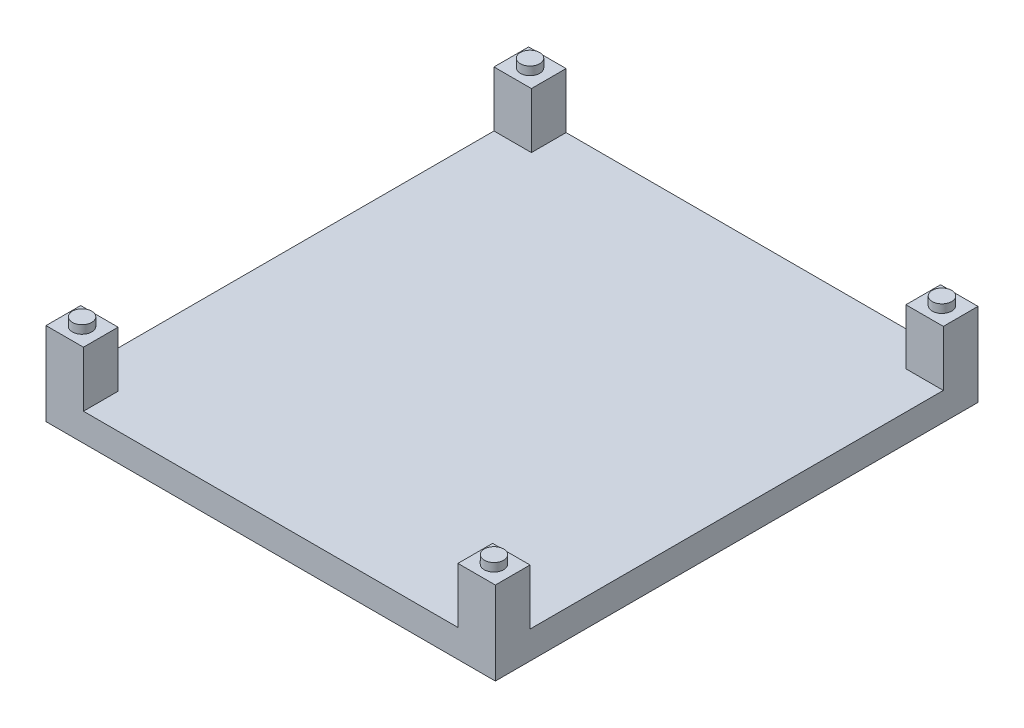
ISO-10303-21;
HEADER;
FILE_DESCRIPTION(('STEP AP214'),'2;1');
FILE_NAME('part.step','',(''),(''),'','','');
FILE_SCHEMA(('AUTOMOTIVE_DESIGN { 1 0 10303 214 1 1 1 1 }'));
ENDSEC;
DATA;
#1=APPLICATION_CONTEXT('core data for automotive mechanical design processes');
#2=APPLICATION_PROTOCOL_DEFINITION('international standard','automotive_design',2000,#1);
#3=PRODUCT_CONTEXT('',#1,'mechanical');
#4=PRODUCT('Part','Part','',(#3));
#5=PRODUCT_RELATED_PRODUCT_CATEGORY('part','',(#4));
#6=PRODUCT_DEFINITION_FORMATION('','',#4);
#7=PRODUCT_DEFINITION_CONTEXT('part definition',#1,'design');
#8=PRODUCT_DEFINITION('design','',#6,#7);
#9=PRODUCT_DEFINITION_SHAPE('','',#8);
#10=(LENGTH_UNIT() NAMED_UNIT(*) SI_UNIT(.MILLI.,.METRE.));
#11=(NAMED_UNIT(*) PLANE_ANGLE_UNIT() SI_UNIT($,.RADIAN.));
#12=(NAMED_UNIT(*) SI_UNIT($,.STERADIAN.) SOLID_ANGLE_UNIT());
#13=UNCERTAINTY_MEASURE_WITH_UNIT(LENGTH_MEASURE(1.E-05),#10,'distance_accuracy_value','');
#14=(GEOMETRIC_REPRESENTATION_CONTEXT(3) GLOBAL_UNCERTAINTY_ASSIGNED_CONTEXT((#13)) GLOBAL_UNIT_ASSIGNED_CONTEXT((#10,
#11,#12)) REPRESENTATION_CONTEXT('',''));
#15=CARTESIAN_POINT('',(0.,0.,0.));
#16=DIRECTION('',(0.,0.,1.));
#17=DIRECTION('',(1.,0.,0.));
#18=AXIS2_PLACEMENT_3D('',#15,#16,#17);
#19=CARTESIAN_POINT('',(0.,5.08,0.));
#20=DIRECTION('',(0.,-1.,0.));
#21=DIRECTION('',(0.,0.,-1.));
#22=AXIS2_PLACEMENT_3D('',#19,#20,#21);
#23=PLANE('',#22);
#24=DIRECTION('',(-1.,0.,0.));
#25=VECTOR('',#24,1.);
#26=CARTESIAN_POINT('',(-34.2899999999991,5.08,37.846));
#27=LINE('',#26,#25);
#28=CARTESIAN_POINT('',(-34.2899999999991,5.08,37.846));
#29=VERTEX_POINT('',#28);
#30=CARTESIAN_POINT('',(-41.148,5.08,37.846));
#31=VERTEX_POINT('',#30);
#32=EDGE_CURVE('E58',#29,#31,#27,.T.);
#33=ORIENTED_EDGE('',*,*,#32,.F.);
#34=DIRECTION('',(0.,0.,-1.));
#35=VECTOR('',#34,1.);
#36=CARTESIAN_POINT('',(-34.2899999999991,5.08,44.1959999999999));
#37=LINE('',#36,#35);
#38=CARTESIAN_POINT('',(-34.2899999999991,5.08,44.196));
#39=VERTEX_POINT('',#38);
#40=EDGE_CURVE('E62',#39,#29,#37,.T.);
#41=ORIENTED_EDGE('',*,*,#40,.F.);
#42=DIRECTION('',(1.,0.,0.));
#43=VECTOR('',#42,1.);
#44=CARTESIAN_POINT('',(-41.148,5.08,44.196));
#45=LINE('',#44,#43);
#46=CARTESIAN_POINT('',(34.2899999999991,5.08,44.1959999999999));
#47=VERTEX_POINT('',#46);
#48=EDGE_CURVE('E262',#39,#47,#45,.T.);
#49=ORIENTED_EDGE('',*,*,#48,.T.);
#50=DIRECTION('',(0.,0.,1.));
#51=VECTOR('',#50,1.);
#52=CARTESIAN_POINT('',(34.2899999999991,5.08,44.1959999999999));
#53=LINE('',#52,#51);
#54=CARTESIAN_POINT('',(34.2899999999991,5.08,37.846));
#55=VERTEX_POINT('',#54);
#56=EDGE_CURVE('E217',#55,#47,#53,.T.);
#57=ORIENTED_EDGE('',*,*,#56,.F.);
#58=DIRECTION('',(-1.,0.,0.));
#59=VECTOR('',#58,1.);
#60=CARTESIAN_POINT('',(34.2899999999991,5.08,37.846));
#61=LINE('',#60,#59);
#62=CARTESIAN_POINT('',(41.1479999999991,5.08,37.846));
#63=VERTEX_POINT('',#62);
#64=EDGE_CURVE('E215',#63,#55,#61,.T.);
#65=ORIENTED_EDGE('',*,*,#64,.F.);
#66=DIRECTION('',(0.,0.,1.));
#67=VECTOR('',#66,1.);
#68=CARTESIAN_POINT('',(41.148,5.08,-44.196));
#69=LINE('',#68,#67);
#70=CARTESIAN_POINT('',(41.148,5.08,-37.846));
#71=VERTEX_POINT('',#70);
#72=EDGE_CURVE('E264',#71,#63,#69,.T.);
#73=ORIENTED_EDGE('',*,*,#72,.F.);
#74=DIRECTION('',(1.,0.,0.));
#75=VECTOR('',#74,1.);
#76=CARTESIAN_POINT('',(34.29,5.08,-37.8460000000001));
#77=LINE('',#76,#75);
#78=CARTESIAN_POINT('',(34.29,5.08,-37.8460000000001));
#79=VERTEX_POINT('',#78);
#80=EDGE_CURVE('E190',#79,#71,#77,.T.);
#81=ORIENTED_EDGE('',*,*,#80,.F.);
#82=DIRECTION('',(0.,0.,1.));
#83=VECTOR('',#82,1.);
#84=CARTESIAN_POINT('',(34.29,5.08,-37.8460000000001));
#85=LINE('',#84,#83);
#86=CARTESIAN_POINT('',(34.29,5.08,-44.196));
#87=VERTEX_POINT('',#86);
#88=EDGE_CURVE('E192',#87,#79,#85,.T.);
#89=ORIENTED_EDGE('',*,*,#88,.F.);
#90=DIRECTION('',(1.,0.,0.));
#91=VECTOR('',#90,1.);
#92=CARTESIAN_POINT('',(-41.148,5.08,-44.196));
#93=LINE('',#92,#91);
#94=CARTESIAN_POINT('',(-34.29,5.08,-44.196));
#95=VERTEX_POINT('',#94);
#96=EDGE_CURVE('E267',#95,#87,#93,.T.);
#97=ORIENTED_EDGE('',*,*,#96,.F.);
#98=DIRECTION('',(0.,0.,-1.));
#99=VECTOR('',#98,1.);
#100=CARTESIAN_POINT('',(-34.29,5.08,-37.8460000000001));
#101=LINE('',#100,#99);
#102=CARTESIAN_POINT('',(-34.29,5.08,-37.8460000000001));
#103=VERTEX_POINT('',#102);
#104=EDGE_CURVE('E234',#103,#95,#101,.T.);
#105=ORIENTED_EDGE('',*,*,#104,.F.);
#106=DIRECTION('',(1.,0.,0.));
#107=VECTOR('',#106,1.);
#108=CARTESIAN_POINT('',(-34.29,5.08,-37.8460000000001));
#109=LINE('',#108,#107);
#110=CARTESIAN_POINT('',(-41.148,5.08,-37.846));
#111=VERTEX_POINT('',#110);
#112=EDGE_CURVE('E221',#111,#103,#109,.T.);
#113=ORIENTED_EDGE('',*,*,#112,.F.);
#114=DIRECTION('',(0.,0.,1.));
#115=VECTOR('',#114,1.);
#116=CARTESIAN_POINT('',(-41.148,5.08,-44.196));
#117=LINE('',#116,#115);
#118=EDGE_CURVE('E270',#111,#31,#117,.T.);
#119=ORIENTED_EDGE('',*,*,#118,.T.);
#120=EDGE_LOOP('',(#33,#41,#49,#57,#65,#73,#81,#89,#97,#105,#113,#119));
#121=FACE_BOUND('',#120,.T.);
#122=ADVANCED_FACE('F41',(#121),#23,.F.);
#123=CARTESIAN_POINT('',(-41.148,5.08,44.196));
#124=DIRECTION('',(0.,0.,-1.));
#125=DIRECTION('',(-1.,0.,0.));
#126=AXIS2_PLACEMENT_3D('',#123,#124,#125);
#127=PLANE('',#126);
#128=DIRECTION('',(1.,0.,0.));
#129=VECTOR('',#128,1.);
#130=CARTESIAN_POINT('',(-41.148,0.,44.196));
#131=LINE('',#130,#129);
#132=CARTESIAN_POINT('',(-41.148,0.,44.196));
#133=VERTEX_POINT('',#132);
#134=CARTESIAN_POINT('',(41.148,0.,44.196));
#135=VERTEX_POINT('',#134);
#136=EDGE_CURVE('E261',#133,#135,#131,.T.);
#137=ORIENTED_EDGE('',*,*,#136,.T.);
#138=DIRECTION('',(0.,-1.,0.));
#139=VECTOR('',#138,1.);
#140=CARTESIAN_POINT('',(41.148,5.08,44.196));
#141=LINE('',#140,#139);
#142=CARTESIAN_POINT('',(41.1479999999991,15.24,44.196));
#143=VERTEX_POINT('',#142);
#144=EDGE_CURVE('E288',#143,#135,#141,.T.);
#145=ORIENTED_EDGE('',*,*,#144,.F.);
#146=DIRECTION('',(1.,0.,0.));
#147=VECTOR('',#146,1.);
#148=CARTESIAN_POINT('',(34.2899999999991,15.24,44.1959999999999));
#149=LINE('',#148,#147);
#150=CARTESIAN_POINT('',(34.2899999999991,15.24,44.1959999999999));
#151=VERTEX_POINT('',#150);
#152=EDGE_CURVE('E225',#151,#143,#149,.T.);
#153=ORIENTED_EDGE('',*,*,#152,.F.);
#154=DIRECTION('',(0.,-1.,0.));
#155=VECTOR('',#154,1.);
#156=CARTESIAN_POINT('',(34.2899999999991,15.24,44.1959999999999));
#157=LINE('',#156,#155);
#158=EDGE_CURVE('E205',#151,#47,#157,.T.);
#159=ORIENTED_EDGE('',*,*,#158,.T.);
#160=ORIENTED_EDGE('',*,*,#48,.F.);
#161=DIRECTION('',(0.,-1.,0.));
#162=VECTOR('',#161,1.);
#163=CARTESIAN_POINT('',(-34.2899999999991,15.24,44.1959999999999));
#164=LINE('',#163,#162);
#165=CARTESIAN_POINT('',(-34.2899999999991,15.24,44.1959999999999));
#166=VERTEX_POINT('',#165);
#167=EDGE_CURVE('E171',#166,#39,#164,.T.);
#168=ORIENTED_EDGE('',*,*,#167,.F.);
#169=DIRECTION('',(1.,0.,0.));
#170=VECTOR('',#169,1.);
#171=CARTESIAN_POINT('',(-34.2899999999991,15.24,44.1959999999999));
#172=LINE('',#171,#170);
#173=CARTESIAN_POINT('',(-41.1479999999992,15.24,44.196));
#174=VERTEX_POINT('',#173);
#175=EDGE_CURVE('E162',#174,#166,#172,.T.);
#176=ORIENTED_EDGE('',*,*,#175,.F.);
#177=DIRECTION('',(0.,-1.,0.));
#178=VECTOR('',#177,1.);
#179=CARTESIAN_POINT('',(-41.148,5.08,44.196));
#180=LINE('',#179,#178);
#181=EDGE_CURVE('E272',#174,#133,#180,.T.);
#182=ORIENTED_EDGE('',*,*,#181,.T.);
#183=EDGE_LOOP('',(#137,#145,#153,#159,#160,#168,#176,#182));
#184=FACE_BOUND('',#183,.T.);
#185=ADVANCED_FACE('F337',(#184),#127,.F.);
#186=CARTESIAN_POINT('',(41.148,5.08,-44.196));
#187=DIRECTION('',(1.,0.,0.));
#188=DIRECTION('',(0.,0.,-1.));
#189=AXIS2_PLACEMENT_3D('',#186,#187,#188);
#190=PLANE('',#189);
#191=DIRECTION('',(0.,0.,1.));
#192=VECTOR('',#191,1.);
#193=CARTESIAN_POINT('',(41.148,0.,-44.196));
#194=LINE('',#193,#192);
#195=CARTESIAN_POINT('',(41.148,0.,-44.196));
#196=VERTEX_POINT('',#195);
#197=EDGE_CURVE('E275',#196,#135,#194,.T.);
#198=ORIENTED_EDGE('',*,*,#197,.F.);
#199=DIRECTION('',(0.,-1.,0.));
#200=VECTOR('',#199,1.);
#201=CARTESIAN_POINT('',(41.148,5.08,-44.196));
#202=LINE('',#201,#200);
#203=CARTESIAN_POINT('',(41.148,15.24,-44.196));
#204=VERTEX_POINT('',#203);
#205=EDGE_CURVE('E286',#204,#196,#202,.T.);
#206=ORIENTED_EDGE('',*,*,#205,.F.);
#207=DIRECTION('',(0.,0.,-1.));
#208=VECTOR('',#207,1.);
#209=CARTESIAN_POINT('',(41.148,15.24,-37.846));
#210=LINE('',#209,#208);
#211=CARTESIAN_POINT('',(41.148,15.24,-37.846));
#212=VERTEX_POINT('',#211);
#213=EDGE_CURVE('E198',#212,#204,#210,.T.);
#214=ORIENTED_EDGE('',*,*,#213,.F.);
#215=DIRECTION('',(0.,-1.,0.));
#216=VECTOR('',#215,1.);
#217=CARTESIAN_POINT('',(41.148,15.24,-37.846));
#218=LINE('',#217,#216);
#219=EDGE_CURVE('E184',#212,#71,#218,.T.);
#220=ORIENTED_EDGE('',*,*,#219,.T.);
#221=ORIENTED_EDGE('',*,*,#72,.T.);
#222=DIRECTION('',(0.,-1.,0.));
#223=VECTOR('',#222,1.);
#224=CARTESIAN_POINT('',(41.1479999999991,15.24,37.846));
#225=LINE('',#224,#223);
#226=CARTESIAN_POINT('',(41.1479999999991,15.24,37.846));
#227=VERTEX_POINT('',#226);
#228=EDGE_CURVE('E208',#227,#63,#225,.T.);
#229=ORIENTED_EDGE('',*,*,#228,.F.);
#230=DIRECTION('',(0.,0.,-1.));
#231=VECTOR('',#230,1.);
#232=CARTESIAN_POINT('',(41.1479999999991,15.24,44.196));
#233=LINE('',#232,#231);
#234=EDGE_CURVE('E223',#143,#227,#233,.T.);
#235=ORIENTED_EDGE('',*,*,#234,.F.);
#236=ORIENTED_EDGE('',*,*,#144,.T.);
#237=EDGE_LOOP('',(#198,#206,#214,#220,#221,#229,#235,#236));
#238=FACE_BOUND('',#237,.T.);
#239=ADVANCED_FACE('F317',(#238),#190,.T.);
#240=CARTESIAN_POINT('',(-41.148,5.08,-44.196));
#241=DIRECTION('',(0.,0.,-1.));
#242=DIRECTION('',(-1.,0.,0.));
#243=AXIS2_PLACEMENT_3D('',#240,#241,#242);
#244=PLANE('',#243);
#245=DIRECTION('',(1.,0.,0.));
#246=VECTOR('',#245,1.);
#247=CARTESIAN_POINT('',(-41.148,0.,-44.196));
#248=LINE('',#247,#246);
#249=CARTESIAN_POINT('',(-41.148,0.,-44.196));
#250=VERTEX_POINT('',#249);
#251=EDGE_CURVE('E278',#250,#196,#248,.T.);
#252=ORIENTED_EDGE('',*,*,#251,.F.);
#253=DIRECTION('',(0.,-1.,0.));
#254=VECTOR('',#253,1.);
#255=CARTESIAN_POINT('',(-41.148,5.08,-44.196));
#256=LINE('',#255,#254);
#257=CARTESIAN_POINT('',(-41.148,15.24,-44.196));
#258=VERTEX_POINT('',#257);
#259=EDGE_CURVE('E284',#258,#250,#256,.T.);
#260=ORIENTED_EDGE('',*,*,#259,.F.);
#261=DIRECTION('',(-1.,0.,0.));
#262=VECTOR('',#261,1.);
#263=CARTESIAN_POINT('',(-34.29,15.24,-44.196));
#264=LINE('',#263,#262);
#265=CARTESIAN_POINT('',(-34.29,15.24,-44.196));
#266=VERTEX_POINT('',#265);
#267=EDGE_CURVE('E238',#266,#258,#264,.T.);
#268=ORIENTED_EDGE('',*,*,#267,.F.);
#269=DIRECTION('',(0.,-1.,0.));
#270=VECTOR('',#269,1.);
#271=CARTESIAN_POINT('',(-34.29,15.24,-44.196));
#272=LINE('',#271,#270);
#273=EDGE_CURVE('E241',#266,#95,#272,.T.);
#274=ORIENTED_EDGE('',*,*,#273,.T.);
#275=ORIENTED_EDGE('',*,*,#96,.T.);
#276=DIRECTION('',(0.,-1.,0.));
#277=VECTOR('',#276,1.);
#278=CARTESIAN_POINT('',(34.29,15.24,-44.196));
#279=LINE('',#278,#277);
#280=CARTESIAN_POINT('',(34.29,15.24,-44.196));
#281=VERTEX_POINT('',#280);
#282=EDGE_CURVE('E187',#281,#87,#279,.T.);
#283=ORIENTED_EDGE('',*,*,#282,.F.);
#284=DIRECTION('',(-1.,0.,0.));
#285=VECTOR('',#284,1.);
#286=CARTESIAN_POINT('',(34.29,15.24,-44.196));
#287=LINE('',#286,#285);
#288=EDGE_CURVE('E189',#204,#281,#287,.T.);
#289=ORIENTED_EDGE('',*,*,#288,.F.);
#290=ORIENTED_EDGE('',*,*,#205,.T.);
#291=EDGE_LOOP('',(#252,#260,#268,#274,#275,#283,#289,#290));
#292=FACE_BOUND('',#291,.T.);
#293=ADVANCED_FACE('F320',(#292),#244,.T.);
#294=CARTESIAN_POINT('',(-41.148,5.08,-44.196));
#295=DIRECTION('',(1.,0.,0.));
#296=DIRECTION('',(0.,0.,-1.));
#297=AXIS2_PLACEMENT_3D('',#294,#295,#296);
#298=PLANE('',#297);
#299=DIRECTION('',(0.,0.,1.));
#300=VECTOR('',#299,1.);
#301=CARTESIAN_POINT('',(-41.148,0.,-44.196));
#302=LINE('',#301,#300);
#303=EDGE_CURVE('E265',#250,#133,#302,.T.);
#304=ORIENTED_EDGE('',*,*,#303,.T.);
#305=ORIENTED_EDGE('',*,*,#181,.F.);
#306=DIRECTION('',(0.,0.,1.));
#307=VECTOR('',#306,1.);
#308=CARTESIAN_POINT('',(-41.1479999999992,15.24,44.196));
#309=LINE('',#308,#307);
#310=CARTESIAN_POINT('',(-41.1479999999992,15.24,37.846));
#311=VERTEX_POINT('',#310);
#312=EDGE_CURVE('E176',#311,#174,#309,.T.);
#313=ORIENTED_EDGE('',*,*,#312,.F.);
#314=DIRECTION('',(0.,-1.,0.));
#315=VECTOR('',#314,1.);
#316=CARTESIAN_POINT('',(-41.1479999999992,15.24,37.846));
#317=LINE('',#316,#315);
#318=EDGE_CURVE('E175',#311,#31,#317,.T.);
#319=ORIENTED_EDGE('',*,*,#318,.T.);
#320=ORIENTED_EDGE('',*,*,#118,.F.);
#321=DIRECTION('',(0.,-1.,0.));
#322=VECTOR('',#321,1.);
#323=CARTESIAN_POINT('',(-41.148,15.24,-37.846));
#324=LINE('',#323,#322);
#325=CARTESIAN_POINT('',(-41.148,15.24,-37.846));
#326=VERTEX_POINT('',#325);
#327=EDGE_CURVE('E249',#326,#111,#324,.T.);
#328=ORIENTED_EDGE('',*,*,#327,.F.);
#329=DIRECTION('',(0.,0.,1.));
#330=VECTOR('',#329,1.);
#331=CARTESIAN_POINT('',(-41.148,15.24,-37.846));
#332=LINE('',#331,#330);
#333=EDGE_CURVE('E230',#258,#326,#332,.T.);
#334=ORIENTED_EDGE('',*,*,#333,.F.);
#335=ORIENTED_EDGE('',*,*,#259,.T.);
#336=EDGE_LOOP('',(#304,#305,#313,#319,#320,#328,#334,#335));
#337=FACE_BOUND('',#336,.T.);
#338=ADVANCED_FACE('F349',(#337),#298,.F.);
#339=CARTESIAN_POINT('',(37.719,0.,-41.021));
#340=DIRECTION('',(0.,-1.,0.));
#341=DIRECTION('',(0.,0.,-1.));
#342=AXIS2_PLACEMENT_3D('',#339,#340,#341);
#343=PLANE('',#342);
#344=ORIENTED_EDGE('',*,*,#136,.F.);
#345=ORIENTED_EDGE('',*,*,#303,.F.);
#346=ORIENTED_EDGE('',*,*,#251,.T.);
#347=ORIENTED_EDGE('',*,*,#197,.T.);
#348=EDGE_LOOP('',(#344,#345,#346,#347));
#349=FACE_BOUND('',#348,.T.);
#350=ADVANCED_FACE('F340',(#349),#343,.T.);
#351=CARTESIAN_POINT('',(-34.29,15.24,-37.8460000000001));
#352=DIRECTION('',(0.,0.,-1.));
#353=DIRECTION('',(-1.,0.,0.));
#354=AXIS2_PLACEMENT_3D('',#351,#352,#353);
#355=PLANE('',#354);
#356=ORIENTED_EDGE('',*,*,#112,.T.);
#357=DIRECTION('',(0.,-1.,0.));
#358=VECTOR('',#357,1.);
#359=CARTESIAN_POINT('',(-34.29,15.24,-37.8460000000001));
#360=LINE('',#359,#358);
#361=CARTESIAN_POINT('',(-34.29,15.24,-37.8460000000001));
#362=VERTEX_POINT('',#361);
#363=EDGE_CURVE('E246',#362,#103,#360,.T.);
#364=ORIENTED_EDGE('',*,*,#363,.F.);
#365=DIRECTION('',(1.,0.,0.));
#366=VECTOR('',#365,1.);
#367=CARTESIAN_POINT('',(-34.29,15.24,-37.8460000000001));
#368=LINE('',#367,#366);
#369=EDGE_CURVE('E233',#326,#362,#368,.T.);
#370=ORIENTED_EDGE('',*,*,#369,.F.);
#371=ORIENTED_EDGE('',*,*,#327,.T.);
#372=EDGE_LOOP('',(#356,#364,#370,#371));
#373=FACE_BOUND('',#372,.T.);
#374=ADVANCED_FACE('F353',(#373),#355,.F.);
#375=CARTESIAN_POINT('',(-34.29,15.24,-37.8460000000001));
#376=DIRECTION('',(-1.,0.,0.));
#377=DIRECTION('',(0.,0.,1.));
#378=AXIS2_PLACEMENT_3D('',#375,#376,#377);
#379=PLANE('',#378);
#380=ORIENTED_EDGE('',*,*,#104,.T.);
#381=ORIENTED_EDGE('',*,*,#273,.F.);
#382=DIRECTION('',(0.,0.,-1.));
#383=VECTOR('',#382,1.);
#384=CARTESIAN_POINT('',(-34.29,15.24,-37.8460000000001));
#385=LINE('',#384,#383);
#386=EDGE_CURVE('E236',#362,#266,#385,.T.);
#387=ORIENTED_EDGE('',*,*,#386,.F.);
#388=ORIENTED_EDGE('',*,*,#363,.T.);
#389=EDGE_LOOP('',(#380,#381,#387,#388));
#390=FACE_BOUND('',#389,.T.);
#391=ADVANCED_FACE('F356',(#390),#379,.F.);
#392=CARTESIAN_POINT('',(0.,15.24,0.));
#393=DIRECTION('',(0.,1.,0.));
#394=DIRECTION('',(0.,0.,1.));
#395=AXIS2_PLACEMENT_3D('',#392,#393,#394);
#396=PLANE('',#395);
#397=CARTESIAN_POINT('',(-37.719,15.24,-41.021));
#398=DIRECTION('',(0.,1.,0.));
#399=DIRECTION('',(0.,0.,1.));
#400=AXIS2_PLACEMENT_3D('',#397,#398,#399);
#401=CIRCLE('',#400,1.778);
#402=CARTESIAN_POINT('',(-37.719,15.24,-39.243));
#403=VERTEX_POINT('',#402);
#404=EDGE_CURVE('E251',#403,#403,#401,.T.);
#405=ORIENTED_EDGE('',*,*,#404,.F.);
#406=EDGE_LOOP('',(#405));
#407=FACE_BOUND('',#406,.T.);
#408=ORIENTED_EDGE('',*,*,#333,.T.);
#409=ORIENTED_EDGE('',*,*,#369,.T.);
#410=ORIENTED_EDGE('',*,*,#386,.T.);
#411=ORIENTED_EDGE('',*,*,#267,.T.);
#412=EDGE_LOOP('',(#408,#409,#410,#411));
#413=FACE_BOUND('',#412,.T.);
#414=ADVANCED_FACE('F345',(#407,#413),#396,.T.);
#415=CARTESIAN_POINT('',(-37.719,16.764,-41.021));
#416=DIRECTION('',(0.,1.,0.));
#417=DIRECTION('',(0.,0.,1.));
#418=AXIS2_PLACEMENT_3D('',#415,#416,#417);
#419=PLANE('',#418);
#420=CARTESIAN_POINT('',(-37.719,16.764,-41.021));
#421=DIRECTION('',(0.,1.,0.));
#422=DIRECTION('',(0.,0.,1.));
#423=AXIS2_PLACEMENT_3D('',#420,#421,#422);
#424=CIRCLE('',#423,1.778);
#425=CARTESIAN_POINT('',(-37.719,16.764,-39.243));
#426=VERTEX_POINT('',#425);
#427=EDGE_CURVE('E258',#426,#426,#424,.T.);
#428=ORIENTED_EDGE('',*,*,#427,.T.);
#429=EDGE_LOOP('',(#428));
#430=FACE_BOUND('',#429,.T.);
#431=ADVANCED_FACE('F363',(#430),#419,.T.);
#432=CARTESIAN_POINT('',(-37.719,16.764,-41.021));
#433=DIRECTION('',(0.,-1.,0.));
#434=DIRECTION('',(0.,0.,-1.));
#435=AXIS2_PLACEMENT_3D('',#432,#433,#434);
#436=CYLINDRICAL_SURFACE('',#435,1.778);
#437=ORIENTED_EDGE('',*,*,#404,.T.);
#438=EDGE_LOOP('',(#437));
#439=FACE_BOUND('',#438,.T.);
#440=ORIENTED_EDGE('',*,*,#427,.F.);
#441=EDGE_LOOP('',(#440));
#442=FACE_BOUND('',#441,.T.);
#443=ADVANCED_FACE('F399',(#439,#442),#436,.T.);
#444=CARTESIAN_POINT('',(34.2899999999991,15.24,44.1959999999999));
#445=DIRECTION('',(1.,0.,0.));
#446=DIRECTION('',(0.,0.,-1.));
#447=AXIS2_PLACEMENT_3D('',#444,#445,#446);
#448=PLANE('',#447);
#449=ORIENTED_EDGE('',*,*,#56,.T.);
#450=ORIENTED_EDGE('',*,*,#158,.F.);
#451=DIRECTION('',(0.,0.,1.));
#452=VECTOR('',#451,1.);
#453=CARTESIAN_POINT('',(34.2899999999991,15.24,44.1959999999999));
#454=LINE('',#453,#452);
#455=CARTESIAN_POINT('',(34.2899999999991,15.24,37.846));
#456=VERTEX_POINT('',#455);
#457=EDGE_CURVE('E218',#456,#151,#454,.T.);
#458=ORIENTED_EDGE('',*,*,#457,.F.);
#459=DIRECTION('',(0.,-1.,0.));
#460=VECTOR('',#459,1.);
#461=CARTESIAN_POINT('',(34.2899999999991,15.24,37.846));
#462=LINE('',#461,#460);
#463=EDGE_CURVE('E211',#456,#55,#462,.T.);
#464=ORIENTED_EDGE('',*,*,#463,.T.);
#465=EDGE_LOOP('',(#449,#450,#458,#464));
#466=FACE_BOUND('',#465,.T.);
#467=ADVANCED_FACE('F493',(#466),#448,.F.);
#468=CARTESIAN_POINT('',(34.2899999999991,15.24,37.846));
#469=DIRECTION('',(0.,0.,1.));
#470=DIRECTION('',(1.,0.,0.));
#471=AXIS2_PLACEMENT_3D('',#468,#469,#470);
#472=PLANE('',#471);
#473=ORIENTED_EDGE('',*,*,#64,.T.);
#474=ORIENTED_EDGE('',*,*,#463,.F.);
#475=DIRECTION('',(-1.,0.,0.));
#476=VECTOR('',#475,1.);
#477=CARTESIAN_POINT('',(34.2899999999991,15.24,37.846));
#478=LINE('',#477,#476);
#479=EDGE_CURVE('E214',#227,#456,#478,.T.);
#480=ORIENTED_EDGE('',*,*,#479,.F.);
#481=ORIENTED_EDGE('',*,*,#228,.T.);
#482=EDGE_LOOP('',(#473,#474,#480,#481));
#483=FACE_BOUND('',#482,.T.);
#484=ADVANCED_FACE('F329',(#483),#472,.F.);
#485=CARTESIAN_POINT('',(0.,15.24,0.));
#486=DIRECTION('',(0.,-1.,0.));
#487=DIRECTION('',(0.,0.,-1.));
#488=AXIS2_PLACEMENT_3D('',#485,#486,#487);
#489=PLANE('',#488);
#490=CARTESIAN_POINT('',(37.719,15.24,41.021));
#491=DIRECTION('',(0.,-1.,0.));
#492=DIRECTION('',(0.,0.,-1.));
#493=AXIS2_PLACEMENT_3D('',#490,#491,#492);
#494=CIRCLE('',#493,1.778);
#495=CARTESIAN_POINT('',(37.719,15.24,39.243));
#496=VERTEX_POINT('',#495);
#497=EDGE_CURVE('E11',#496,#496,#494,.T.);
#498=ORIENTED_EDGE('',*,*,#497,.T.);
#499=EDGE_LOOP('',(#498));
#500=FACE_BOUND('',#499,.T.);
#501=ORIENTED_EDGE('',*,*,#457,.T.);
#502=ORIENTED_EDGE('',*,*,#152,.T.);
#503=ORIENTED_EDGE('',*,*,#234,.T.);
#504=ORIENTED_EDGE('',*,*,#479,.T.);
#505=EDGE_LOOP('',(#501,#502,#503,#504));
#506=FACE_BOUND('',#505,.T.);
#507=ADVANCED_FACE('F333',(#500,#506),#489,.F.);
#508=CARTESIAN_POINT('',(37.719,16.764,41.021));
#509=DIRECTION('',(0.,1.,0.));
#510=DIRECTION('',(0.,0.,1.));
#511=AXIS2_PLACEMENT_3D('',#508,#509,#510);
#512=PLANE('',#511);
#513=CARTESIAN_POINT('',(37.719,16.764,41.021));
#514=DIRECTION('',(0.,1.,0.));
#515=DIRECTION('',(0.,0.,1.));
#516=AXIS2_PLACEMENT_3D('',#513,#514,#515);
#517=CIRCLE('',#516,1.778);
#518=CARTESIAN_POINT('',(37.719,16.764,42.799));
#519=VERTEX_POINT('',#518);
#520=EDGE_CURVE('E252',#519,#519,#517,.T.);
#521=ORIENTED_EDGE('',*,*,#520,.T.);
#522=EDGE_LOOP('',(#521));
#523=FACE_BOUND('',#522,.T.);
#524=ADVANCED_FACE('F413',(#523),#512,.T.);
#525=CARTESIAN_POINT('',(37.719,16.764,41.021));
#526=DIRECTION('',(0.,-1.,0.));
#527=DIRECTION('',(0.,0.,-1.));
#528=AXIS2_PLACEMENT_3D('',#525,#526,#527);
#529=CYLINDRICAL_SURFACE('',#528,1.778);
#530=ORIENTED_EDGE('',*,*,#520,.F.);
#531=EDGE_LOOP('',(#530));
#532=FACE_BOUND('',#531,.T.);
#533=ORIENTED_EDGE('',*,*,#497,.F.);
#534=EDGE_LOOP('',(#533));
#535=FACE_BOUND('',#534,.T.);
#536=ADVANCED_FACE('F415',(#532,#535),#529,.T.);
#537=CARTESIAN_POINT('',(34.29,15.24,-37.8460000000001));
#538=DIRECTION('',(1.,0.,0.));
#539=DIRECTION('',(0.,0.,-1.));
#540=AXIS2_PLACEMENT_3D('',#537,#538,#539);
#541=PLANE('',#540);
#542=ORIENTED_EDGE('',*,*,#88,.T.);
#543=DIRECTION('',(0.,-1.,0.));
#544=VECTOR('',#543,1.);
#545=CARTESIAN_POINT('',(34.29,15.24,-37.8460000000001));
#546=LINE('',#545,#544);
#547=CARTESIAN_POINT('',(34.29,15.24,-37.8460000000001));
#548=VERTEX_POINT('',#547);
#549=EDGE_CURVE('E182',#548,#79,#546,.T.);
#550=ORIENTED_EDGE('',*,*,#549,.F.);
#551=DIRECTION('',(0.,0.,1.));
#552=VECTOR('',#551,1.);
#553=CARTESIAN_POINT('',(34.29,15.24,-37.8460000000001));
#554=LINE('',#553,#552);
#555=EDGE_CURVE('E193',#281,#548,#554,.T.);
#556=ORIENTED_EDGE('',*,*,#555,.F.);
#557=ORIENTED_EDGE('',*,*,#282,.T.);
#558=EDGE_LOOP('',(#542,#550,#556,#557));
#559=FACE_BOUND('',#558,.T.);
#560=ADVANCED_FACE('F309',(#559),#541,.F.);
#561=CARTESIAN_POINT('',(34.29,15.24,-37.8460000000001));
#562=DIRECTION('',(0.,0.,-1.));
#563=DIRECTION('',(-1.,0.,0.));
#564=AXIS2_PLACEMENT_3D('',#561,#562,#563);
#565=PLANE('',#564);
#566=ORIENTED_EDGE('',*,*,#80,.T.);
#567=ORIENTED_EDGE('',*,*,#219,.F.);
#568=DIRECTION('',(1.,0.,0.));
#569=VECTOR('',#568,1.);
#570=CARTESIAN_POINT('',(34.29,15.24,-37.8460000000001));
#571=LINE('',#570,#569);
#572=EDGE_CURVE('E201',#548,#212,#571,.T.);
#573=ORIENTED_EDGE('',*,*,#572,.F.);
#574=ORIENTED_EDGE('',*,*,#549,.T.);
#575=EDGE_LOOP('',(#566,#567,#573,#574));
#576=FACE_BOUND('',#575,.T.);
#577=ADVANCED_FACE('F301',(#576),#565,.F.);
#578=CARTESIAN_POINT('',(0.,15.24,0.));
#579=DIRECTION('',(0.,-1.,0.));
#580=DIRECTION('',(0.,0.,-1.));
#581=AXIS2_PLACEMENT_3D('',#578,#579,#580);
#582=PLANE('',#581);
#583=CARTESIAN_POINT('',(37.719,15.24,-41.021));
#584=DIRECTION('',(0.,-1.,0.));
#585=DIRECTION('',(0.,0.,-1.));
#586=AXIS2_PLACEMENT_3D('',#583,#584,#585);
#587=CIRCLE('',#586,1.778);
#588=CARTESIAN_POINT('',(37.719,15.24,-42.799));
#589=VERTEX_POINT('',#588);
#590=EDGE_CURVE('E196',#589,#589,#587,.F.);
#591=ORIENTED_EDGE('',*,*,#590,.F.);
#592=EDGE_LOOP('',(#591));
#593=FACE_BOUND('',#592,.T.);
#594=ORIENTED_EDGE('',*,*,#555,.T.);
#595=ORIENTED_EDGE('',*,*,#572,.T.);
#596=ORIENTED_EDGE('',*,*,#213,.T.);
#597=ORIENTED_EDGE('',*,*,#288,.T.);
#598=EDGE_LOOP('',(#594,#595,#596,#597));
#599=FACE_BOUND('',#598,.T.);
#600=ADVANCED_FACE('F297',(#593,#599),#582,.F.);
#601=CARTESIAN_POINT('',(37.719,16.764,-41.021));
#602=DIRECTION('',(0.,-1.,0.));
#603=DIRECTION('',(0.,0.,-1.));
#604=AXIS2_PLACEMENT_3D('',#601,#602,#603);
#605=PLANE('',#604);
#606=CARTESIAN_POINT('',(37.719,16.764,-41.021));
#607=DIRECTION('',(0.,-1.,0.));
#608=DIRECTION('',(0.,0.,-1.));
#609=AXIS2_PLACEMENT_3D('',#606,#607,#608);
#610=CIRCLE('',#609,1.778);
#611=CARTESIAN_POINT('',(37.719,16.764,-42.799));
#612=VERTEX_POINT('',#611);
#613=EDGE_CURVE('E50',#612,#612,#610,.T.);
#614=ORIENTED_EDGE('',*,*,#613,.F.);
#615=EDGE_LOOP('',(#614));
#616=FACE_BOUND('',#615,.T.);
#617=ADVANCED_FACE('F300',(#616),#605,.F.);
#618=CARTESIAN_POINT('',(37.719,16.764,-41.021));
#619=DIRECTION('',(0.,-1.,0.));
#620=DIRECTION('',(0.,0.,-1.));
#621=AXIS2_PLACEMENT_3D('',#618,#619,#620);
#622=CYLINDRICAL_SURFACE('',#621,1.778);
#623=ORIENTED_EDGE('',*,*,#613,.T.);
#624=EDGE_LOOP('',(#623));
#625=FACE_BOUND('',#624,.T.);
#626=ORIENTED_EDGE('',*,*,#590,.T.);
#627=EDGE_LOOP('',(#626));
#628=FACE_BOUND('',#627,.T.);
#629=ADVANCED_FACE('F43',(#625,#628),#622,.T.);
#630=CARTESIAN_POINT('',(-34.2899999999991,15.24,37.846));
#631=DIRECTION('',(0.,0.,1.));
#632=DIRECTION('',(1.,0.,0.));
#633=AXIS2_PLACEMENT_3D('',#630,#631,#632);
#634=PLANE('',#633);
#635=ORIENTED_EDGE('',*,*,#32,.T.);
#636=ORIENTED_EDGE('',*,*,#318,.F.);
#637=DIRECTION('',(-1.,0.,0.));
#638=VECTOR('',#637,1.);
#639=CARTESIAN_POINT('',(-34.2899999999991,15.24,37.846));
#640=LINE('',#639,#638);
#641=CARTESIAN_POINT('',(-34.2899999999991,15.24,37.846));
#642=VERTEX_POINT('',#641);
#643=EDGE_CURVE('E159',#642,#311,#640,.T.);
#644=ORIENTED_EDGE('',*,*,#643,.F.);
#645=DIRECTION('',(0.,-1.,0.));
#646=VECTOR('',#645,1.);
#647=CARTESIAN_POINT('',(-34.2899999999991,15.24,37.846));
#648=LINE('',#647,#646);
#649=EDGE_CURVE('E166',#642,#29,#648,.T.);
#650=ORIENTED_EDGE('',*,*,#649,.T.);
#651=EDGE_LOOP('',(#635,#636,#644,#650));
#652=FACE_BOUND('',#651,.T.);
#653=ADVANCED_FACE('F173',(#652),#634,.F.);
#654=CARTESIAN_POINT('',(-34.2899999999991,15.24,44.1959999999999));
#655=DIRECTION('',(-1.,0.,0.));
#656=DIRECTION('',(0.,0.,1.));
#657=AXIS2_PLACEMENT_3D('',#654,#655,#656);
#658=PLANE('',#657);
#659=ORIENTED_EDGE('',*,*,#40,.T.);
#660=ORIENTED_EDGE('',*,*,#649,.F.);
#661=DIRECTION('',(0.,0.,-1.));
#662=VECTOR('',#661,1.);
#663=CARTESIAN_POINT('',(-34.2899999999991,15.24,44.1959999999999));
#664=LINE('',#663,#662);
#665=EDGE_CURVE('E154',#166,#642,#664,.T.);
#666=ORIENTED_EDGE('',*,*,#665,.F.);
#667=ORIENTED_EDGE('',*,*,#167,.T.);
#668=EDGE_LOOP('',(#659,#660,#666,#667));
#669=FACE_BOUND('',#668,.T.);
#670=ADVANCED_FACE('F169',(#669),#658,.F.);
#671=CARTESIAN_POINT('',(0.,15.24,0.));
#672=DIRECTION('',(0.,-1.,0.));
#673=DIRECTION('',(0.,0.,-1.));
#674=AXIS2_PLACEMENT_3D('',#671,#672,#673);
#675=PLANE('',#674);
#676=CARTESIAN_POINT('',(-37.719,15.24,41.021));
#677=DIRECTION('',(0.,-1.,0.));
#678=DIRECTION('',(0.,0.,-1.));
#679=AXIS2_PLACEMENT_3D('',#676,#677,#678);
#680=CIRCLE('',#679,1.778);
#681=CARTESIAN_POINT('',(-37.719,15.24,39.243));
#682=VERTEX_POINT('',#681);
#683=EDGE_CURVE('E45',#682,#682,#680,.F.);
#684=ORIENTED_EDGE('',*,*,#683,.F.);
#685=EDGE_LOOP('',(#684));
#686=FACE_BOUND('',#685,.T.);
#687=ORIENTED_EDGE('',*,*,#643,.T.);
#688=ORIENTED_EDGE('',*,*,#312,.T.);
#689=ORIENTED_EDGE('',*,*,#175,.T.);
#690=ORIENTED_EDGE('',*,*,#665,.T.);
#691=EDGE_LOOP('',(#687,#688,#689,#690));
#692=FACE_BOUND('',#691,.T.);
#693=ADVANCED_FACE('F156',(#686,#692),#675,.F.);
#694=CARTESIAN_POINT('',(-37.719,16.764,41.021));
#695=DIRECTION('',(0.,-1.,0.));
#696=DIRECTION('',(0.,0.,-1.));
#697=AXIS2_PLACEMENT_3D('',#694,#695,#696);
#698=PLANE('',#697);
#699=CARTESIAN_POINT('',(-37.719,16.764,41.021));
#700=DIRECTION('',(0.,-1.,0.));
#701=DIRECTION('',(0.,0.,-1.));
#702=AXIS2_PLACEMENT_3D('',#699,#700,#701);
#703=CIRCLE('',#702,1.778);
#704=CARTESIAN_POINT('',(-37.719,16.764,39.243));
#705=VERTEX_POINT('',#704);
#706=EDGE_CURVE('E255',#705,#705,#703,.T.);
#707=ORIENTED_EDGE('',*,*,#706,.F.);
#708=EDGE_LOOP('',(#707));
#709=FACE_BOUND('',#708,.T.);
#710=ADVANCED_FACE('F405',(#709),#698,.F.);
#711=CARTESIAN_POINT('',(-37.719,16.764,41.021));
#712=DIRECTION('',(0.,-1.,0.));
#713=DIRECTION('',(0.,0.,-1.));
#714=AXIS2_PLACEMENT_3D('',#711,#712,#713);
#715=CYLINDRICAL_SURFACE('',#714,1.778);
#716=ORIENTED_EDGE('',*,*,#706,.T.);
#717=EDGE_LOOP('',(#716));
#718=FACE_BOUND('',#717,.T.);
#719=ORIENTED_EDGE('',*,*,#683,.T.);
#720=EDGE_LOOP('',(#719));
#721=FACE_BOUND('',#720,.T.);
#722=ADVANCED_FACE('F407',(#718,#721),#715,.T.);
#723=CLOSED_SHELL('',(#122,#185,#239,#293,#338,#350,#374,#391,#414,#431,#443,#467,#484,#507,
#524,#536,#560,#577,#600,#617,#629,#653,#670,#693,#710,#722));
#724=MANIFOLD_SOLID_BREP('B2',#723);
#725=ADVANCED_BREP_SHAPE_REPRESENTATION('',(#18,#724),#14);
#726=SHAPE_DEFINITION_REPRESENTATION(#9,#725);
ENDSEC;
END-ISO-10303-21;
